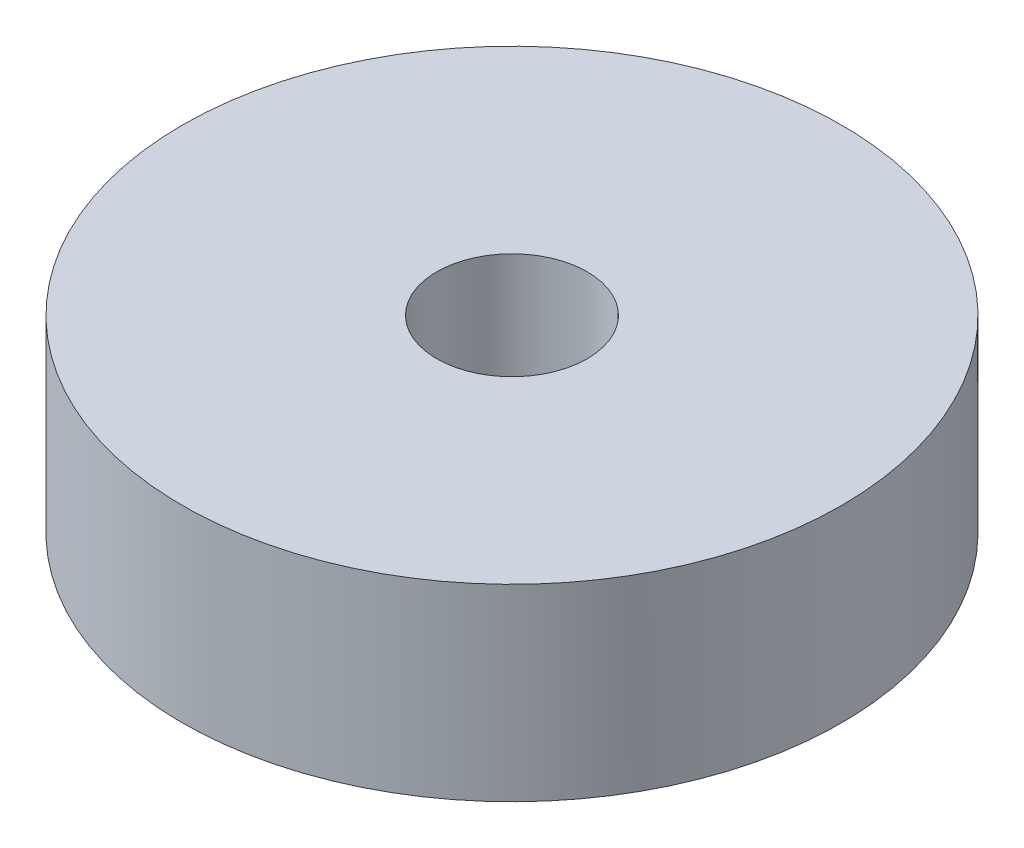
ISO-10303-21;
HEADER;
FILE_DESCRIPTION(('STEP AP214'),'2;1');
FILE_NAME('part.step','',(''),(''),'','','');
FILE_SCHEMA(('AUTOMOTIVE_DESIGN { 1 0 10303 214 1 1 1 1 }'));
ENDSEC;
DATA;
#1=APPLICATION_CONTEXT('core data for automotive mechanical design processes');
#2=APPLICATION_PROTOCOL_DEFINITION('international standard','automotive_design',2000,#1);
#3=PRODUCT_CONTEXT('',#1,'mechanical');
#4=PRODUCT('Part','Part','',(#3));
#5=PRODUCT_RELATED_PRODUCT_CATEGORY('part','',(#4));
#6=PRODUCT_DEFINITION_FORMATION('','',#4);
#7=PRODUCT_DEFINITION_CONTEXT('part definition',#1,'design');
#8=PRODUCT_DEFINITION('design','',#6,#7);
#9=PRODUCT_DEFINITION_SHAPE('','',#8);
#10=(LENGTH_UNIT() NAMED_UNIT(*) SI_UNIT(.MILLI.,.METRE.));
#11=(NAMED_UNIT(*) PLANE_ANGLE_UNIT() SI_UNIT($,.RADIAN.));
#12=(NAMED_UNIT(*) SI_UNIT($,.STERADIAN.) SOLID_ANGLE_UNIT());
#13=UNCERTAINTY_MEASURE_WITH_UNIT(LENGTH_MEASURE(1.E-05),#10,'distance_accuracy_value','');
#14=(GEOMETRIC_REPRESENTATION_CONTEXT(3) GLOBAL_UNCERTAINTY_ASSIGNED_CONTEXT((#13)) GLOBAL_UNIT_ASSIGNED_CONTEXT((#10,
#11,#12)) REPRESENTATION_CONTEXT('',''));
#15=CARTESIAN_POINT('',(0.,0.,0.));
#16=DIRECTION('',(0.,0.,1.));
#17=DIRECTION('',(1.,0.,0.));
#18=AXIS2_PLACEMENT_3D('',#15,#16,#17);
#19=CARTESIAN_POINT('',(-46.2541002310008,3.81,16.993426234333));
#20=DIRECTION('',(0.,1.,0.));
#21=DIRECTION('',(1.,0.,0.));
#22=AXIS2_PLACEMENT_3D('',#19,#20,#21);
#23=PLANE('',#22);
#24=CARTESIAN_POINT('',(-76.2,3.81,8.77323748878821));
#25=DIRECTION('',(0.,1.,0.));
#26=DIRECTION('',(1.,0.,0.));
#27=AXIS2_PLACEMENT_3D('',#24,#25,#26);
#28=CIRCLE('',#27,2.53999999999999);
#29=CARTESIAN_POINT('',(-73.66,3.81,8.77323748878821));
#30=VERTEX_POINT('',#29);
#31=EDGE_CURVE('E37',#30,#30,#28,.T.);
#32=ORIENTED_EDGE('',*,*,#31,.T.);
#33=EDGE_LOOP('',(#32));
#34=FACE_BOUND('',#33,.T.);
#35=CARTESIAN_POINT('',(-76.2,3.81,8.77323748878821));
#36=DIRECTION('',(0.,-1.,0.));
#37=DIRECTION('',(-1.,0.,0.));
#38=AXIS2_PLACEMENT_3D('',#35,#36,#37);
#39=CIRCLE('',#38,11.1125);
#40=CARTESIAN_POINT('',(-87.3125,3.81,8.77323748878821));
#41=VERTEX_POINT('',#40);
#42=EDGE_CURVE('E45',#41,#41,#39,.F.);
#43=ORIENTED_EDGE('',*,*,#42,.F.);
#44=EDGE_LOOP('',(#43));
#45=FACE_BOUND('',#44,.T.);
#46=ADVANCED_FACE('F34',(#34,#45),#23,.F.);
#47=CARTESIAN_POINT('',(-76.2,10.16,8.77323748878821));
#48=DIRECTION('',(0.,1.,0.));
#49=DIRECTION('',(1.,0.,0.));
#50=AXIS2_PLACEMENT_3D('',#47,#48,#49);
#51=PLANE('',#50);
#52=CARTESIAN_POINT('',(-76.2,10.16,8.77323748878821));
#53=DIRECTION('',(0.,1.,0.));
#54=DIRECTION('',(1.,0.,0.));
#55=AXIS2_PLACEMENT_3D('',#52,#53,#54);
#56=CIRCLE('',#55,11.1125);
#57=CARTESIAN_POINT('',(-65.0875,10.16,8.77323748878821));
#58=VERTEX_POINT('',#57);
#59=EDGE_CURVE('E41',#58,#58,#56,.T.);
#60=ORIENTED_EDGE('',*,*,#59,.T.);
#61=EDGE_LOOP('',(#60));
#62=FACE_BOUND('',#61,.T.);
#63=CARTESIAN_POINT('',(-76.2,10.16,8.77323748878821));
#64=DIRECTION('',(0.,1.,0.));
#65=DIRECTION('',(1.,0.,0.));
#66=AXIS2_PLACEMENT_3D('',#63,#64,#65);
#67=CIRCLE('',#66,2.53999999999999);
#68=CARTESIAN_POINT('',(-73.66,10.16,8.77323748878821));
#69=VERTEX_POINT('',#68);
#70=EDGE_CURVE('E10',#69,#69,#67,.T.);
#71=ORIENTED_EDGE('',*,*,#70,.F.);
#72=EDGE_LOOP('',(#71));
#73=FACE_BOUND('',#72,.T.);
#74=ADVANCED_FACE('F59',(#62,#73),#51,.T.);
#75=CARTESIAN_POINT('',(-76.2,10.16,8.77323748878821));
#76=DIRECTION('',(0.,-1.,0.));
#77=DIRECTION('',(-1.,0.,0.));
#78=AXIS2_PLACEMENT_3D('',#75,#76,#77);
#79=CYLINDRICAL_SURFACE('',#78,2.53999999999999);
#80=ORIENTED_EDGE('',*,*,#70,.T.);
#81=EDGE_LOOP('',(#80));
#82=FACE_BOUND('',#81,.T.);
#83=ORIENTED_EDGE('',*,*,#31,.F.);
#84=EDGE_LOOP('',(#83));
#85=FACE_BOUND('',#84,.T.);
#86=ADVANCED_FACE('F56',(#82,#85),#79,.F.);
#87=CARTESIAN_POINT('',(-76.2,10.16,8.77323748878821));
#88=DIRECTION('',(0.,-1.,0.));
#89=DIRECTION('',(-1.,0.,0.));
#90=AXIS2_PLACEMENT_3D('',#87,#88,#89);
#91=CYLINDRICAL_SURFACE('',#90,11.1125);
#92=ORIENTED_EDGE('',*,*,#59,.F.);
#93=EDGE_LOOP('',(#92));
#94=FACE_BOUND('',#93,.T.);
#95=ORIENTED_EDGE('',*,*,#42,.T.);
#96=EDGE_LOOP('',(#95));
#97=FACE_BOUND('',#96,.T.);
#98=ADVANCED_FACE('F58',(#94,#97),#91,.T.);
#99=CLOSED_SHELL('',(#46,#74,#86,#98));
#100=MANIFOLD_SOLID_BREP('B2',#99);
#101=ADVANCED_BREP_SHAPE_REPRESENTATION('',(#18,#100),#14);
#102=SHAPE_DEFINITION_REPRESENTATION(#9,#101);
ENDSEC;
END-ISO-10303-21;
